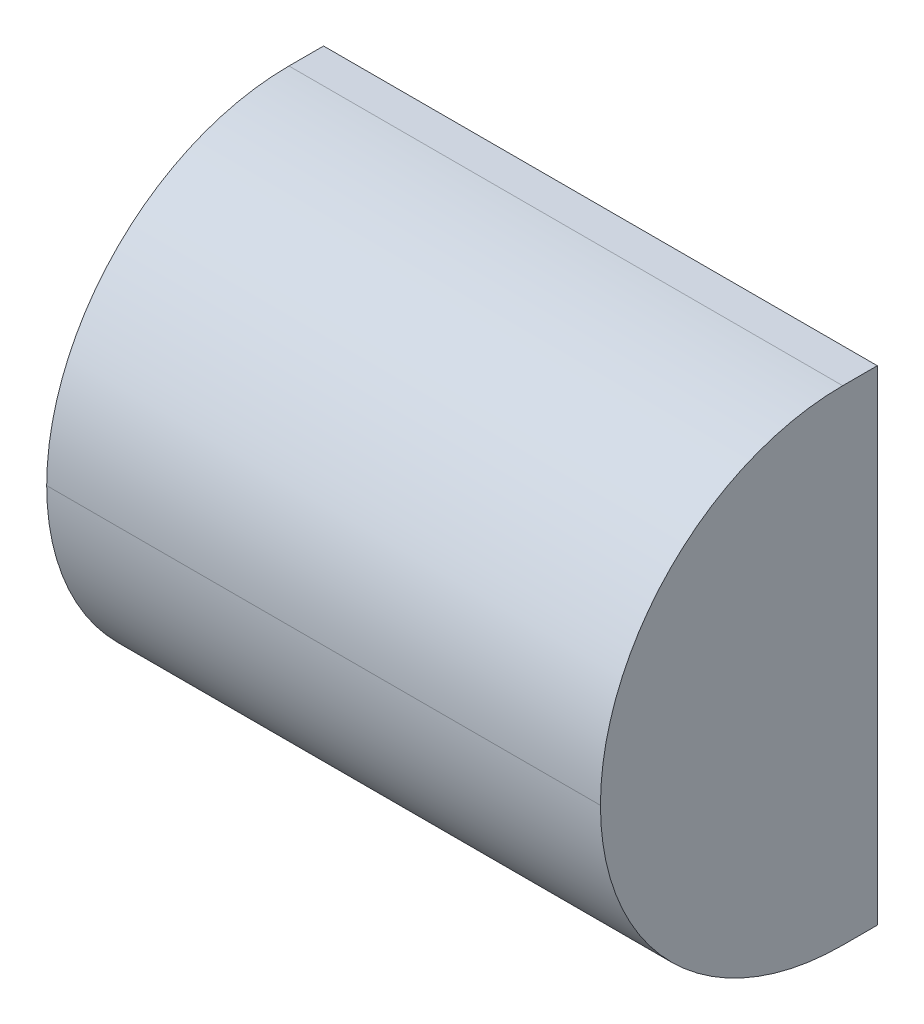
ISO-10303-21;
HEADER;
FILE_DESCRIPTION(('STEP AP214'),'2;1');
FILE_NAME('part.step','',(''),(''),'','','');
FILE_SCHEMA(('AUTOMOTIVE_DESIGN { 1 0 10303 214 1 1 1 1 }'));
ENDSEC;
DATA;
#1=APPLICATION_CONTEXT('core data for automotive mechanical design processes');
#2=APPLICATION_PROTOCOL_DEFINITION('international standard','automotive_design',2000,#1);
#3=PRODUCT_CONTEXT('',#1,'mechanical');
#4=PRODUCT('Part','Part','',(#3));
#5=PRODUCT_RELATED_PRODUCT_CATEGORY('part','',(#4));
#6=PRODUCT_DEFINITION_FORMATION('','',#4);
#7=PRODUCT_DEFINITION_CONTEXT('part definition',#1,'design');
#8=PRODUCT_DEFINITION('design','',#6,#7);
#9=PRODUCT_DEFINITION_SHAPE('','',#8);
#10=(LENGTH_UNIT() NAMED_UNIT(*) SI_UNIT(.MILLI.,.METRE.));
#11=(NAMED_UNIT(*) PLANE_ANGLE_UNIT() SI_UNIT($,.RADIAN.));
#12=(NAMED_UNIT(*) SI_UNIT($,.STERADIAN.) SOLID_ANGLE_UNIT());
#13=UNCERTAINTY_MEASURE_WITH_UNIT(LENGTH_MEASURE(1.E-05),#10,'distance_accuracy_value','');
#14=(GEOMETRIC_REPRESENTATION_CONTEXT(3) GLOBAL_UNCERTAINTY_ASSIGNED_CONTEXT((#13)) GLOBAL_UNIT_ASSIGNED_CONTEXT((#10,
#11,#12)) REPRESENTATION_CONTEXT('',''));
#15=CARTESIAN_POINT('',(0.,0.,0.));
#16=DIRECTION('',(0.,0.,1.));
#17=DIRECTION('',(1.,0.,0.));
#18=AXIS2_PLACEMENT_3D('',#15,#16,#17);
#19=CARTESIAN_POINT('',(0.,0.,4.));
#20=DIRECTION('',(1.,0.,0.));
#21=DIRECTION('',(0.,0.,-1.));
#22=AXIS2_PLACEMENT_3D('',#19,#20,#21);
#23=PLANE('',#22);
#24=DIRECTION('',(0.,0.,-1.));
#25=VECTOR('',#24,1.);
#26=CARTESIAN_POINT('',(0.,0.,4.));
#27=LINE('',#26,#25);
#28=CARTESIAN_POINT('',(0.,0.,0.5));
#29=VERTEX_POINT('',#28);
#30=CARTESIAN_POINT('',(0.,0.,0.));
#31=VERTEX_POINT('',#30);
#32=EDGE_CURVE('E77',#29,#31,#27,.T.);
#33=ORIENTED_EDGE('',*,*,#32,.F.);
#34=CARTESIAN_POINT('',(0.,3.5,0.5));
#35=DIRECTION('',(1.,0.,0.));
#36=DIRECTION('',(0.,0.,-1.));
#37=AXIS2_PLACEMENT_3D('',#34,#35,#36);
#38=CIRCLE('',#37,3.5);
#39=CARTESIAN_POINT('',(0.,3.5,4.));
#40=VERTEX_POINT('',#39);
#41=EDGE_CURVE('E42',#29,#40,#38,.F.);
#42=ORIENTED_EDGE('',*,*,#41,.T.);
#43=CARTESIAN_POINT('',(0.,3.5,0.5));
#44=DIRECTION('',(1.,0.,0.));
#45=DIRECTION('',(0.,0.,-1.));
#46=AXIS2_PLACEMENT_3D('',#43,#44,#45);
#47=CIRCLE('',#46,3.5);
#48=CARTESIAN_POINT('',(0.,7.,0.5));
#49=VERTEX_POINT('',#48);
#50=EDGE_CURVE('E49',#40,#49,#47,.F.);
#51=ORIENTED_EDGE('',*,*,#50,.T.);
#52=DIRECTION('',(0.,0.,-1.));
#53=VECTOR('',#52,1.);
#54=CARTESIAN_POINT('',(0.,7.,4.));
#55=LINE('',#54,#53);
#56=CARTESIAN_POINT('',(0.,7.,0.));
#57=VERTEX_POINT('',#56);
#58=EDGE_CURVE('E97',#49,#57,#55,.T.);
#59=ORIENTED_EDGE('',*,*,#58,.T.);
#60=DIRECTION('',(0.,-1.,0.));
#61=VECTOR('',#60,1.);
#62=CARTESIAN_POINT('',(0.,0.,0.));
#63=LINE('',#62,#61);
#64=EDGE_CURVE('E93',#57,#31,#63,.T.);
#65=ORIENTED_EDGE('',*,*,#64,.T.);
#66=EDGE_LOOP('',(#33,#42,#51,#59,#65));
#67=FACE_BOUND('',#66,.T.);
#68=ADVANCED_FACE('F33',(#67),#23,.F.);
#69=CARTESIAN_POINT('',(0.,0.,4.));
#70=DIRECTION('',(0.,1.,0.));
#71=DIRECTION('',(0.,0.,1.));
#72=AXIS2_PLACEMENT_3D('',#69,#70,#71);
#73=PLANE('',#72);
#74=DIRECTION('',(0.,0.,-1.));
#75=VECTOR('',#74,1.);
#76=CARTESIAN_POINT('',(8.,0.,4.));
#77=LINE('',#76,#75);
#78=CARTESIAN_POINT('',(8.,0.,0.5));
#79=VERTEX_POINT('',#78);
#80=CARTESIAN_POINT('',(8.,0.,0.));
#81=VERTEX_POINT('',#80);
#82=EDGE_CURVE('E87',#79,#81,#77,.T.);
#83=ORIENTED_EDGE('',*,*,#82,.F.);
#84=DIRECTION('',(1.,0.,0.));
#85=VECTOR('',#84,1.);
#86=CARTESIAN_POINT('',(0.,0.,0.5));
#87=LINE('',#86,#85);
#88=EDGE_CURVE('E84',#79,#29,#87,.F.);
#89=ORIENTED_EDGE('',*,*,#88,.T.);
#90=ORIENTED_EDGE('',*,*,#32,.T.);
#91=DIRECTION('',(1.,0.,0.));
#92=VECTOR('',#91,1.);
#93=CARTESIAN_POINT('',(0.,0.,0.));
#94=LINE('',#93,#92);
#95=EDGE_CURVE('E81',#31,#81,#94,.T.);
#96=ORIENTED_EDGE('',*,*,#95,.T.);
#97=EDGE_LOOP('',(#83,#89,#90,#96));
#98=FACE_BOUND('',#97,.T.);
#99=ADVANCED_FACE('F80',(#98),#73,.F.);
#100=CARTESIAN_POINT('',(8.,0.,4.));
#101=DIRECTION('',(-1.,0.,0.));
#102=DIRECTION('',(0.,0.,1.));
#103=AXIS2_PLACEMENT_3D('',#100,#101,#102);
#104=PLANE('',#103);
#105=CARTESIAN_POINT('',(8.,3.5,0.5));
#106=DIRECTION('',(-1.,0.,0.));
#107=DIRECTION('',(0.,0.,1.));
#108=AXIS2_PLACEMENT_3D('',#105,#106,#107);
#109=CIRCLE('',#108,3.5);
#110=CARTESIAN_POINT('',(8.,7.,0.5));
#111=VERTEX_POINT('',#110);
#112=CARTESIAN_POINT('',(8.,3.5,4.));
#113=VERTEX_POINT('',#112);
#114=EDGE_CURVE('E86',#111,#113,#109,.F.);
#115=ORIENTED_EDGE('',*,*,#114,.T.);
#116=CARTESIAN_POINT('',(8.,3.5,0.5));
#117=DIRECTION('',(-1.,0.,0.));
#118=DIRECTION('',(0.,0.,1.));
#119=AXIS2_PLACEMENT_3D('',#116,#117,#118);
#120=CIRCLE('',#119,3.5);
#121=EDGE_CURVE('E110',#113,#79,#120,.F.);
#122=ORIENTED_EDGE('',*,*,#121,.T.);
#123=ORIENTED_EDGE('',*,*,#82,.T.);
#124=DIRECTION('',(0.,1.,0.));
#125=VECTOR('',#124,1.);
#126=CARTESIAN_POINT('',(8.,0.,0.));
#127=LINE('',#126,#125);
#128=CARTESIAN_POINT('',(8.,7.,0.));
#129=VERTEX_POINT('',#128);
#130=EDGE_CURVE('E95',#81,#129,#127,.T.);
#131=ORIENTED_EDGE('',*,*,#130,.T.);
#132=DIRECTION('',(0.,0.,-1.));
#133=VECTOR('',#132,1.);
#134=CARTESIAN_POINT('',(8.,7.,4.));
#135=LINE('',#134,#133);
#136=EDGE_CURVE('E106',#111,#129,#135,.T.);
#137=ORIENTED_EDGE('',*,*,#136,.F.);
#138=EDGE_LOOP('',(#115,#122,#123,#131,#137));
#139=FACE_BOUND('',#138,.T.);
#140=ADVANCED_FACE('F116',(#139),#104,.F.);
#141=CARTESIAN_POINT('',(0.,7.,4.));
#142=DIRECTION('',(0.,-1.,0.));
#143=DIRECTION('',(0.,0.,-1.));
#144=AXIS2_PLACEMENT_3D('',#141,#142,#143);
#145=PLANE('',#144);
#146=ORIENTED_EDGE('',*,*,#58,.F.);
#147=DIRECTION('',(-1.,0.,0.));
#148=VECTOR('',#147,1.);
#149=CARTESIAN_POINT('',(0.,7.,0.5));
#150=LINE('',#149,#148);
#151=EDGE_CURVE('E11',#49,#111,#150,.F.);
#152=ORIENTED_EDGE('',*,*,#151,.T.);
#153=ORIENTED_EDGE('',*,*,#136,.T.);
#154=DIRECTION('',(-1.,0.,0.));
#155=VECTOR('',#154,1.);
#156=CARTESIAN_POINT('',(0.,7.,0.));
#157=LINE('',#156,#155);
#158=EDGE_CURVE('E103',#129,#57,#157,.T.);
#159=ORIENTED_EDGE('',*,*,#158,.T.);
#160=EDGE_LOOP('',(#146,#152,#153,#159));
#161=FACE_BOUND('',#160,.T.);
#162=ADVANCED_FACE('F125',(#161),#145,.F.);
#163=CARTESIAN_POINT('',(0.,0.,0.));
#164=DIRECTION('',(0.,0.,-1.));
#165=DIRECTION('',(-1.,0.,0.));
#166=AXIS2_PLACEMENT_3D('',#163,#164,#165);
#167=PLANE('',#166);
#168=ORIENTED_EDGE('',*,*,#64,.F.);
#169=ORIENTED_EDGE('',*,*,#158,.F.);
#170=ORIENTED_EDGE('',*,*,#130,.F.);
#171=ORIENTED_EDGE('',*,*,#95,.F.);
#172=EDGE_LOOP('',(#168,#169,#170,#171));
#173=FACE_BOUND('',#172,.T.);
#174=ADVANCED_FACE('F91',(#173),#167,.T.);
#175=CARTESIAN_POINT('',(0.,3.5,0.5));
#176=DIRECTION('',(-1.,0.,0.));
#177=DIRECTION('',(0.,0.,1.));
#178=AXIS2_PLACEMENT_3D('',#175,#176,#177);
#179=CYLINDRICAL_SURFACE('',#178,3.5);
#180=ORIENTED_EDGE('',*,*,#151,.F.);
#181=ORIENTED_EDGE('',*,*,#50,.F.);
#182=DIRECTION('',(-1.,0.,0.));
#183=VECTOR('',#182,1.);
#184=CARTESIAN_POINT('',(0.,3.5,4.));
#185=LINE('',#184,#183);
#186=EDGE_CURVE('E37',#113,#40,#185,.T.);
#187=ORIENTED_EDGE('',*,*,#186,.F.);
#188=ORIENTED_EDGE('',*,*,#114,.F.);
#189=EDGE_LOOP('',(#180,#181,#187,#188));
#190=FACE_BOUND('',#189,.T.);
#191=ADVANCED_FACE('F35',(#190),#179,.T.);
#192=CARTESIAN_POINT('',(0.,3.5,0.5));
#193=DIRECTION('',(1.,0.,0.));
#194=DIRECTION('',(0.,0.,-1.));
#195=AXIS2_PLACEMENT_3D('',#192,#193,#194);
#196=CYLINDRICAL_SURFACE('',#195,3.5);
#197=ORIENTED_EDGE('',*,*,#41,.F.);
#198=ORIENTED_EDGE('',*,*,#88,.F.);
#199=ORIENTED_EDGE('',*,*,#121,.F.);
#200=ORIENTED_EDGE('',*,*,#186,.T.);
#201=EDGE_LOOP('',(#197,#198,#199,#200));
#202=FACE_BOUND('',#201,.T.);
#203=ADVANCED_FACE('F121',(#202),#196,.T.);
#204=CLOSED_SHELL('',(#68,#99,#140,#162,#174,#191,#203));
#205=MANIFOLD_SOLID_BREP('B2',#204);
#206=ADVANCED_BREP_SHAPE_REPRESENTATION('',(#18,#205),#14);
#207=SHAPE_DEFINITION_REPRESENTATION(#9,#206);
ENDSEC;
END-ISO-10303-21;
